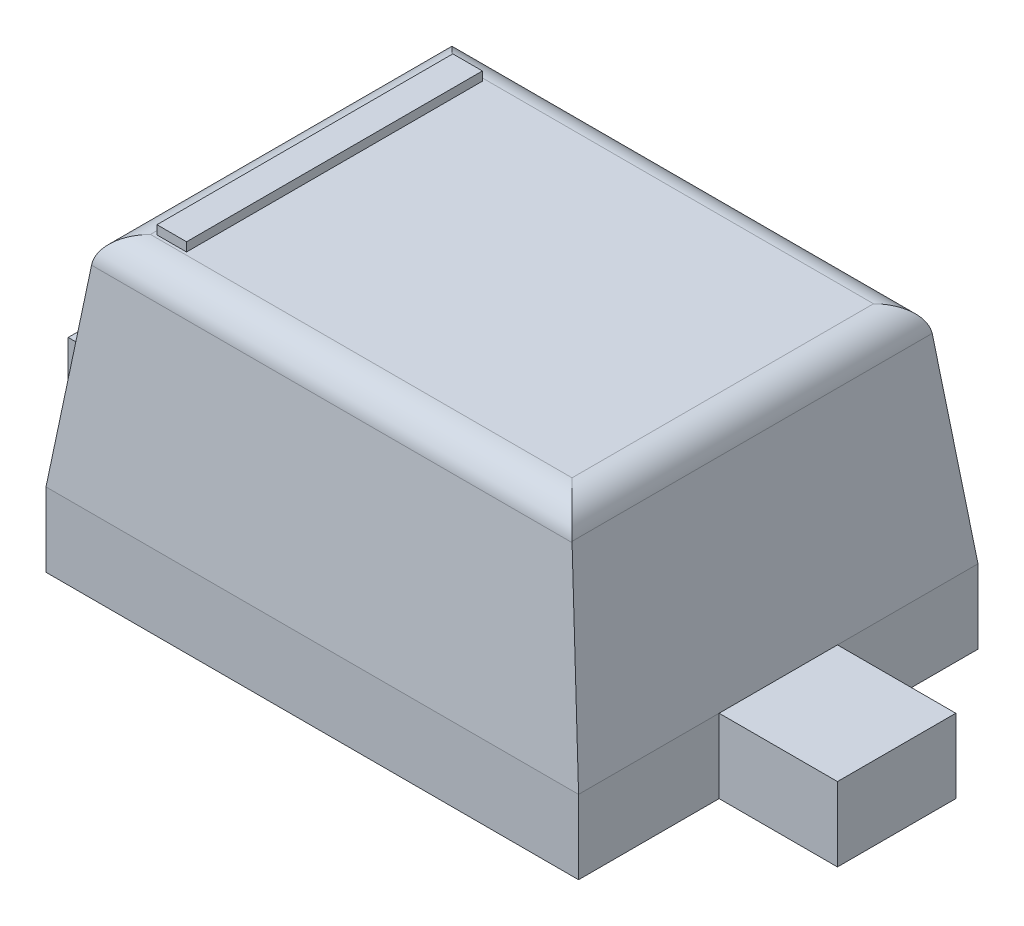
ISO-10303-21;
HEADER;
FILE_DESCRIPTION(('STEP AP214'),'2;1');
FILE_NAME('part.step','',(''),(''),'','','');
FILE_SCHEMA(('AUTOMOTIVE_DESIGN { 1 0 10303 214 1 1 1 1 }'));
ENDSEC;
DATA;
#1=APPLICATION_CONTEXT('core data for automotive mechanical design processes');
#2=APPLICATION_PROTOCOL_DEFINITION('international standard','automotive_design',2000,#1);
#3=PRODUCT_CONTEXT('',#1,'mechanical');
#4=PRODUCT('Part','Part','',(#3));
#5=PRODUCT_RELATED_PRODUCT_CATEGORY('part','',(#4));
#6=PRODUCT_DEFINITION_FORMATION('','',#4);
#7=PRODUCT_DEFINITION_CONTEXT('part definition',#1,'design');
#8=PRODUCT_DEFINITION('design','',#6,#7);
#9=PRODUCT_DEFINITION_SHAPE('','',#8);
#10=(LENGTH_UNIT() NAMED_UNIT(*) SI_UNIT(.MILLI.,.METRE.));
#11=(NAMED_UNIT(*) PLANE_ANGLE_UNIT() SI_UNIT($,.RADIAN.));
#12=(NAMED_UNIT(*) SI_UNIT($,.STERADIAN.) SOLID_ANGLE_UNIT());
#13=UNCERTAINTY_MEASURE_WITH_UNIT(LENGTH_MEASURE(1.E-05),#10,'distance_accuracy_value','');
#14=(GEOMETRIC_REPRESENTATION_CONTEXT(3) GLOBAL_UNCERTAINTY_ASSIGNED_CONTEXT((#13)) GLOBAL_UNIT_ASSIGNED_CONTEXT((#10,
#11,#12)) REPRESENTATION_CONTEXT('',''));
#15=CARTESIAN_POINT('',(0.,0.,0.));
#16=DIRECTION('',(0.,0.,1.));
#17=DIRECTION('',(1.,0.,0.));
#18=AXIS2_PLACEMENT_3D('',#15,#16,#17);
#19=CARTESIAN_POINT('',(-0.7,1.03,-0.5));
#20=DIRECTION('',(1.,0.,0.));
#21=DIRECTION('',(0.,0.,-1.));
#22=AXIS2_PLACEMENT_3D('',#19,#20,#21);
#23=PLANE('',#22);
#24=DIRECTION('',(0.,0.,1.));
#25=VECTOR('',#24,1.);
#26=CARTESIAN_POINT('',(-0.7,1.,-0.5));
#27=LINE('',#26,#25);
#28=CARTESIAN_POINT('',(-0.7,1.,-0.5));
#29=VERTEX_POINT('',#28);
#30=CARTESIAN_POINT('',(-0.7,1.,0.5));
#31=VERTEX_POINT('',#30);
#32=EDGE_CURVE('E121',#29,#31,#27,.T.);
#33=ORIENTED_EDGE('',*,*,#32,.T.);
#34=DIRECTION('',(0.,-1.,0.));
#35=VECTOR('',#34,1.);
#36=CARTESIAN_POINT('',(-0.7,1.03,0.5));
#37=LINE('',#36,#35);
#38=CARTESIAN_POINT('',(-0.7,1.03,0.5));
#39=VERTEX_POINT('',#38);
#40=EDGE_CURVE('E13',#39,#31,#37,.T.);
#41=ORIENTED_EDGE('',*,*,#40,.F.);
#42=DIRECTION('',(0.,0.,1.));
#43=VECTOR('',#42,1.);
#44=CARTESIAN_POINT('',(-0.7,1.03,-0.5));
#45=LINE('',#44,#43);
#46=CARTESIAN_POINT('',(-0.7,1.03,-0.5));
#47=VERTEX_POINT('',#46);
#48=EDGE_CURVE('E109',#47,#39,#45,.T.);
#49=ORIENTED_EDGE('',*,*,#48,.F.);
#50=DIRECTION('',(0.,-1.,0.));
#51=VECTOR('',#50,1.);
#52=CARTESIAN_POINT('',(-0.7,1.03,-0.5));
#53=LINE('',#52,#51);
#54=EDGE_CURVE('E117',#47,#29,#53,.T.);
#55=ORIENTED_EDGE('',*,*,#54,.T.);
#56=EDGE_LOOP('',(#33,#41,#49,#55));
#57=FACE_BOUND('',#56,.T.);
#58=ADVANCED_FACE('F58',(#57),#23,.F.);
#59=CARTESIAN_POINT('',(-0.7,1.03,0.5));
#60=DIRECTION('',(0.,0.,-1.));
#61=DIRECTION('',(-1.,0.,0.));
#62=AXIS2_PLACEMENT_3D('',#59,#60,#61);
#63=PLANE('',#62);
#64=DIRECTION('',(1.,0.,0.));
#65=VECTOR('',#64,1.);
#66=CARTESIAN_POINT('',(-0.7,1.,0.5));
#67=LINE('',#66,#65);
#68=CARTESIAN_POINT('',(-0.6,1.,0.5));
#69=VERTEX_POINT('',#68);
#70=EDGE_CURVE('E113',#31,#69,#67,.T.);
#71=ORIENTED_EDGE('',*,*,#70,.T.);
#72=DIRECTION('',(0.,-1.,0.));
#73=VECTOR('',#72,1.);
#74=CARTESIAN_POINT('',(-0.6,1.03,0.5));
#75=LINE('',#74,#73);
#76=CARTESIAN_POINT('',(-0.6,1.03,0.5));
#77=VERTEX_POINT('',#76);
#78=EDGE_CURVE('E66',#77,#69,#75,.T.);
#79=ORIENTED_EDGE('',*,*,#78,.F.);
#80=DIRECTION('',(1.,0.,0.));
#81=VECTOR('',#80,1.);
#82=CARTESIAN_POINT('',(-0.7,1.03,0.5));
#83=LINE('',#82,#81);
#84=EDGE_CURVE('E104',#39,#77,#83,.T.);
#85=ORIENTED_EDGE('',*,*,#84,.F.);
#86=ORIENTED_EDGE('',*,*,#40,.T.);
#87=EDGE_LOOP('',(#71,#79,#85,#86));
#88=FACE_BOUND('',#87,.T.);
#89=ADVANCED_FACE('F112',(#88),#63,.F.);
#90=CARTESIAN_POINT('',(-0.6,1.03,-0.5));
#91=DIRECTION('',(-1.,0.,0.));
#92=DIRECTION('',(0.,0.,1.));
#93=AXIS2_PLACEMENT_3D('',#90,#91,#92);
#94=PLANE('',#93);
#95=DIRECTION('',(0.,0.,-1.));
#96=VECTOR('',#95,1.);
#97=CARTESIAN_POINT('',(-0.6,1.,-0.5));
#98=LINE('',#97,#96);
#99=CARTESIAN_POINT('',(-0.6,1.,-0.5));
#100=VERTEX_POINT('',#99);
#101=EDGE_CURVE('E91',#69,#100,#98,.T.);
#102=ORIENTED_EDGE('',*,*,#101,.T.);
#103=DIRECTION('',(0.,-1.,0.));
#104=VECTOR('',#103,1.);
#105=CARTESIAN_POINT('',(-0.6,1.03,-0.5));
#106=LINE('',#105,#104);
#107=CARTESIAN_POINT('',(-0.6,1.03,-0.5));
#108=VERTEX_POINT('',#107);
#109=EDGE_CURVE('E114',#108,#100,#106,.T.);
#110=ORIENTED_EDGE('',*,*,#109,.F.);
#111=DIRECTION('',(0.,0.,-1.));
#112=VECTOR('',#111,1.);
#113=CARTESIAN_POINT('',(-0.6,1.03,-0.5));
#114=LINE('',#113,#112);
#115=EDGE_CURVE('E107',#77,#108,#114,.T.);
#116=ORIENTED_EDGE('',*,*,#115,.F.);
#117=ORIENTED_EDGE('',*,*,#78,.T.);
#118=EDGE_LOOP('',(#102,#110,#116,#117));
#119=FACE_BOUND('',#118,.T.);
#120=ADVANCED_FACE('F115',(#119),#94,.F.);
#121=CARTESIAN_POINT('',(-0.7,1.03,-0.5));
#122=DIRECTION('',(0.,0.,1.));
#123=DIRECTION('',(1.,0.,0.));
#124=AXIS2_PLACEMENT_3D('',#121,#122,#123);
#125=PLANE('',#124);
#126=DIRECTION('',(-1.,0.,0.));
#127=VECTOR('',#126,1.);
#128=CARTESIAN_POINT('',(-0.7,1.,-0.5));
#129=LINE('',#128,#127);
#130=EDGE_CURVE('E97',#100,#29,#129,.T.);
#131=ORIENTED_EDGE('',*,*,#130,.T.);
#132=ORIENTED_EDGE('',*,*,#54,.F.);
#133=DIRECTION('',(-1.,0.,0.));
#134=VECTOR('',#133,1.);
#135=CARTESIAN_POINT('',(-0.7,1.03,-0.5));
#136=LINE('',#135,#134);
#137=EDGE_CURVE('E74',#108,#47,#136,.T.);
#138=ORIENTED_EDGE('',*,*,#137,.F.);
#139=ORIENTED_EDGE('',*,*,#109,.T.);
#140=EDGE_LOOP('',(#131,#132,#138,#139));
#141=FACE_BOUND('',#140,.T.);
#142=ADVANCED_FACE('F128',(#141),#125,.F.);
#143=CARTESIAN_POINT('',(0.,1.03,0.));
#144=DIRECTION('',(0.,1.,0.));
#145=DIRECTION('',(0.,0.,1.));
#146=AXIS2_PLACEMENT_3D('',#143,#144,#145);
#147=PLANE('',#146);
#148=ORIENTED_EDGE('',*,*,#48,.T.);
#149=ORIENTED_EDGE('',*,*,#84,.T.);
#150=ORIENTED_EDGE('',*,*,#115,.T.);
#151=ORIENTED_EDGE('',*,*,#137,.T.);
#152=EDGE_LOOP('',(#148,#149,#150,#151));
#153=FACE_BOUND('',#152,.T.);
#154=ADVANCED_FACE('F105',(#153),#147,.T.);
#155=CARTESIAN_POINT('',(0.,1.,0.));
#156=DIRECTION('',(0.,1.,0.));
#157=DIRECTION('',(0.,0.,1.));
#158=AXIS2_PLACEMENT_3D('',#155,#156,#157);
#159=PLANE('',#158);
#160=ORIENTED_EDGE('',*,*,#32,.F.);
#161=ORIENTED_EDGE('',*,*,#130,.F.);
#162=ORIENTED_EDGE('',*,*,#101,.F.);
#163=ORIENTED_EDGE('',*,*,#70,.F.);
#164=EDGE_LOOP('',(#160,#161,#162,#163));
#165=FACE_BOUND('',#164,.T.);
#166=ADVANCED_FACE('F131',(#165),#159,.F.);
#167=CLOSED_SHELL('',(#58,#89,#120,#142,#154,#166));
#168=MANIFOLD_SOLID_BREP('B2',#167);
#169=CARTESIAN_POINT('',(0.,1.,0.));
#170=DIRECTION('',(0.,1.,0.));
#171=DIRECTION('',(0.,0.,1.));
#172=AXIS2_PLACEMENT_3D('',#169,#170,#171);
#173=PLANE('',#172);
#174=DIRECTION('',(0.,0.,-1.));
#175=VECTOR('',#174,1.);
#176=CARTESIAN_POINT('',(0.712448360330523,1.,-0.6));
#177=LINE('',#176,#175);
#178=CARTESIAN_POINT('',(0.712448360330523,1.,0.509501243788791));
#179=VERTEX_POINT('',#178);
#180=CARTESIAN_POINT('',(0.712448360330523,1.,-0.509501243788791));
#181=VERTEX_POINT('',#180);
#182=EDGE_CURVE('E333',#179,#181,#177,.T.);
#183=ORIENTED_EDGE('',*,*,#182,.T.);
#184=DIRECTION('',(-1.,0.,0.));
#185=VECTOR('',#184,1.);
#186=CARTESIAN_POINT('',(-0.8,1.,-0.509501243788791));
#187=LINE('',#186,#185);
#188=CARTESIAN_POINT('',(-0.712448360330523,1.,-0.509501243788791));
#189=VERTEX_POINT('',#188);
#190=EDGE_CURVE('E335',#181,#189,#187,.T.);
#191=ORIENTED_EDGE('',*,*,#190,.T.);
#192=DIRECTION('',(0.,0.,1.));
#193=VECTOR('',#192,1.);
#194=CARTESIAN_POINT('',(-0.712448360330523,1.,0.6));
#195=LINE('',#194,#193);
#196=CARTESIAN_POINT('',(-0.712448360330523,1.,0.509501243788791));
#197=VERTEX_POINT('',#196);
#198=EDGE_CURVE('E323',#189,#197,#195,.T.);
#199=ORIENTED_EDGE('',*,*,#198,.T.);
#200=DIRECTION('',(1.,0.,0.));
#201=VECTOR('',#200,1.);
#202=CARTESIAN_POINT('',(0.8,1.,0.509501243788791));
#203=LINE('',#202,#201);
#204=EDGE_CURVE('E330',#197,#179,#203,.T.);
#205=ORIENTED_EDGE('',*,*,#204,.T.);
#206=EDGE_LOOP('',(#183,#191,#199,#205));
#207=FACE_BOUND('',#206,.T.);
#208=ADVANCED_FACE('F192',(#207),#173,.T.);
#209=CARTESIAN_POINT('',(0.,0.25,0.));
#210=DIRECTION('',(0.,1.,0.));
#211=DIRECTION('',(0.,0.,1.));
#212=AXIS2_PLACEMENT_3D('',#209,#210,#211);
#213=PLANE('',#212);
#214=DIRECTION('',(0.,0.,1.));
#215=VECTOR('',#214,1.);
#216=CARTESIAN_POINT('',(-0.900000000000001,0.25,0.674999999999999));
#217=LINE('',#216,#215);
#218=CARTESIAN_POINT('',(-0.900000000000001,0.25,-0.674999999999999));
#219=VERTEX_POINT('',#218);
#220=CARTESIAN_POINT('',(-0.900000000000001,0.25,0.674999999999999));
#221=VERTEX_POINT('',#220);
#222=EDGE_CURVE('E318',#219,#221,#217,.T.);
#223=ORIENTED_EDGE('',*,*,#222,.F.);
#224=DIRECTION('',(-1.,0.,0.));
#225=VECTOR('',#224,1.);
#226=CARTESIAN_POINT('',(0.900000000000001,0.25,-0.674999999999999));
#227=LINE('',#226,#225);
#228=CARTESIAN_POINT('',(0.900000000000001,0.25,-0.674999999999999));
#229=VERTEX_POINT('',#228);
#230=EDGE_CURVE('E279',#229,#219,#227,.T.);
#231=ORIENTED_EDGE('',*,*,#230,.F.);
#232=DIRECTION('',(0.,0.,-1.));
#233=VECTOR('',#232,1.);
#234=CARTESIAN_POINT('',(0.900000000000001,0.25,0.674999999999999));
#235=LINE('',#234,#233);
#236=CARTESIAN_POINT('',(0.900000000000001,0.25,0.674999999999999));
#237=VERTEX_POINT('',#236);
#238=EDGE_CURVE('E257',#237,#229,#235,.T.);
#239=ORIENTED_EDGE('',*,*,#238,.F.);
#240=DIRECTION('',(1.,0.,0.));
#241=VECTOR('',#240,1.);
#242=CARTESIAN_POINT('',(0.900000000000001,0.25,0.674999999999999));
#243=LINE('',#242,#241);
#244=EDGE_CURVE('E264',#221,#237,#243,.T.);
#245=ORIENTED_EDGE('',*,*,#244,.F.);
#246=EDGE_LOOP('',(#223,#231,#239,#245));
#247=FACE_BOUND('',#246,.T.);
#248=ADVANCED_FACE('F278',(#247),#213,.F.);
#249=CARTESIAN_POINT('',(0.,0.0693069306930688,0.693069306930692));
#250=DIRECTION('',(0.,-0.0995037190209983,-0.995037190209989));
#251=DIRECTION('',(0.,0.995037190209989,-0.0995037190209984));
#252=AXIS2_PLACEMENT_3D('',#249,#250,#251);
#253=PLANE('',#252);
#254=DIRECTION('',(-0.131519189844287,0.986393923832144,-0.0986393923832138));
#255=VECTOR('',#254,1.);
#256=CARTESIAN_POINT('',(0.900000000000001,0.25,0.674999999999999));
#257=LINE('',#256,#255);
#258=CARTESIAN_POINT('',(0.81200661707972,0.9099503719021,0.60900496280979));
#259=VERTEX_POINT('',#258);
#260=EDGE_CURVE('E253',#237,#259,#257,.T.);
#261=ORIENTED_EDGE('',*,*,#260,.T.);
#262=DIRECTION('',(1.,0.,0.));
#263=VECTOR('',#262,1.);
#264=CARTESIAN_POINT('',(-0.8,0.9099503719021,0.60900496280979));
#265=LINE('',#264,#263);
#266=CARTESIAN_POINT('',(-0.81200661707972,0.9099503719021,0.60900496280979));
#267=VERTEX_POINT('',#266);
#268=EDGE_CURVE('E56',#259,#267,#265,.F.);
#269=ORIENTED_EDGE('',*,*,#268,.T.);
#270=DIRECTION('',(0.131519189844287,0.986393923832144,-0.0986393923832135));
#271=VECTOR('',#270,1.);
#272=CARTESIAN_POINT('',(-0.900000000000001,0.25,0.674999999999999));
#273=LINE('',#272,#271);
#274=EDGE_CURVE('E263',#221,#267,#273,.T.);
#275=ORIENTED_EDGE('',*,*,#274,.F.);
#276=ORIENTED_EDGE('',*,*,#244,.T.);
#277=EDGE_LOOP('',(#261,#269,#275,#276));
#278=FACE_BOUND('',#277,.T.);
#279=ADVANCED_FACE('F268',(#278),#253,.F.);
#280=CARTESIAN_POINT('',(-0.91703056768559,0.12227074235808,0.));
#281=DIRECTION('',(0.991227900682635,-0.132163720091019,0.));
#282=DIRECTION('',(0.132163720091019,0.991227900682635,0.));
#283=AXIS2_PLACEMENT_3D('',#280,#281,#282);
#284=PLANE('',#283);
#285=DIRECTION('',(0.,0.,1.));
#286=VECTOR('',#285,1.);
#287=CARTESIAN_POINT('',(-0.811571150398787,0.913216372009102,-0.6));
#288=LINE('',#287,#286);
#289=CARTESIAN_POINT('',(-0.811571150398787,0.913216372009102,0.608624033857055));
#290=VERTEX_POINT('',#289);
#291=CARTESIAN_POINT('',(-0.811571150398787,0.913216372009102,-0.608624033857054));
#292=VERTEX_POINT('',#291);
#293=EDGE_CURVE('E338',#290,#292,#288,.F.);
#294=ORIENTED_EDGE('',*,*,#293,.T.);
#295=CARTESIAN_POINT('',(-0.813333333333334,0.9,-0.509501243788791));
#296=DIRECTION('',(0.991227900682635,-0.132163720091019,0.));
#297=DIRECTION('',(0.132163720091019,0.991227900682635,0.));
#298=AXIS2_PLACEMENT_3D('',#295,#296,#297);
#299=ELLIPSE('',#298,0.10088497300281,0.1);
#300=CARTESIAN_POINT('',(-0.81200661707972,0.9099503719021,-0.60900496280979));
#301=VERTEX_POINT('',#300);
#302=EDGE_CURVE('E342',#292,#301,#299,.F.);
#303=ORIENTED_EDGE('',*,*,#302,.T.);
#304=DIRECTION('',(0.131519189844287,0.986393923832144,0.0986393923832138));
#305=VECTOR('',#304,1.);
#306=CARTESIAN_POINT('',(-0.900000000000001,0.25,-0.674999999999999));
#307=LINE('',#306,#305);
#308=EDGE_CURVE('E331',#219,#301,#307,.T.);
#309=ORIENTED_EDGE('',*,*,#308,.F.);
#310=ORIENTED_EDGE('',*,*,#222,.T.);
#311=ORIENTED_EDGE('',*,*,#274,.T.);
#312=CARTESIAN_POINT('',(-0.813333333333334,0.9,0.509501243788791));
#313=DIRECTION('',(0.991227900682635,-0.132163720091019,0.));
#314=DIRECTION('',(-0.132163720091019,-0.991227900682635,0.));
#315=AXIS2_PLACEMENT_3D('',#312,#313,#314);
#316=ELLIPSE('',#315,0.10088497300281,0.1);
#317=EDGE_CURVE('E340',#267,#290,#316,.F.);
#318=ORIENTED_EDGE('',*,*,#317,.T.);
#319=EDGE_LOOP('',(#294,#303,#309,#310,#311,#318));
#320=FACE_BOUND('',#319,.T.);
#321=ADVANCED_FACE('F368',(#320),#284,.F.);
#322=CARTESIAN_POINT('',(0.91703056768559,0.12227074235808,0.));
#323=DIRECTION('',(-0.991227900682635,-0.132163720091019,0.));
#324=DIRECTION('',(0.132163720091019,-0.991227900682635,0.));
#325=AXIS2_PLACEMENT_3D('',#322,#323,#324);
#326=PLANE('',#325);
#327=DIRECTION('',(-0.131519189844287,0.986393923832144,0.0986393923832135));
#328=VECTOR('',#327,1.);
#329=CARTESIAN_POINT('',(0.900000000000001,0.25,-0.674999999999999));
#330=LINE('',#329,#328);
#331=CARTESIAN_POINT('',(0.81200661707972,0.9099503719021,-0.60900496280979));
#332=VERTEX_POINT('',#331);
#333=EDGE_CURVE('E397',#229,#332,#330,.T.);
#334=ORIENTED_EDGE('',*,*,#333,.T.);
#335=CARTESIAN_POINT('',(0.813333333333334,0.9,-0.509501243788791));
#336=DIRECTION('',(-0.991227900682635,-0.132163720091019,0.));
#337=DIRECTION('',(0.132163720091019,-0.991227900682635,0.));
#338=AXIS2_PLACEMENT_3D('',#335,#336,#337);
#339=ELLIPSE('',#338,0.10088497300281,0.1);
#340=CARTESIAN_POINT('',(0.811571150398787,0.913216372009102,-0.608624033857055));
#341=VERTEX_POINT('',#340);
#342=EDGE_CURVE('E201',#332,#341,#339,.F.);
#343=ORIENTED_EDGE('',*,*,#342,.T.);
#344=DIRECTION('',(0.,0.,-1.));
#345=VECTOR('',#344,1.);
#346=CARTESIAN_POINT('',(0.811571150398787,0.913216372009102,0.6));
#347=LINE('',#346,#345);
#348=CARTESIAN_POINT('',(0.811571150398787,0.913216372009102,0.608624033857054));
#349=VERTEX_POINT('',#348);
#350=EDGE_CURVE('E212',#341,#349,#347,.F.);
#351=ORIENTED_EDGE('',*,*,#350,.T.);
#352=CARTESIAN_POINT('',(0.813333333333334,0.9,0.509501243788791));
#353=DIRECTION('',(-0.991227900682635,-0.132163720091019,0.));
#354=DIRECTION('',(-0.132163720091019,0.991227900682635,0.));
#355=AXIS2_PLACEMENT_3D('',#352,#353,#354);
#356=ELLIPSE('',#355,0.10088497300281,0.1);
#357=EDGE_CURVE('E260',#349,#259,#356,.F.);
#358=ORIENTED_EDGE('',*,*,#357,.T.);
#359=ORIENTED_EDGE('',*,*,#260,.F.);
#360=ORIENTED_EDGE('',*,*,#238,.T.);
#361=EDGE_LOOP('',(#334,#343,#351,#358,#359,#360));
#362=FACE_BOUND('',#361,.T.);
#363=ADVANCED_FACE('F255',(#362),#326,.F.);
#364=CARTESIAN_POINT('',(0.,0.0693069306930688,-0.693069306930692));
#365=DIRECTION('',(0.,-0.0995037190209983,0.995037190209989));
#366=DIRECTION('',(0.,-0.995037190209989,-0.0995037190209984));
#367=AXIS2_PLACEMENT_3D('',#364,#365,#366);
#368=PLANE('',#367);
#369=ORIENTED_EDGE('',*,*,#308,.T.);
#370=DIRECTION('',(-1.,0.,0.));
#371=VECTOR('',#370,1.);
#372=CARTESIAN_POINT('',(0.8,0.9099503719021,-0.60900496280979));
#373=LINE('',#372,#371);
#374=EDGE_CURVE('E344',#301,#332,#373,.F.);
#375=ORIENTED_EDGE('',*,*,#374,.T.);
#376=ORIENTED_EDGE('',*,*,#333,.F.);
#377=ORIENTED_EDGE('',*,*,#230,.T.);
#378=EDGE_LOOP('',(#369,#375,#376,#377));
#379=FACE_BOUND('',#378,.T.);
#380=ADVANCED_FACE('F389',(#379),#368,.F.);
#381=CARTESIAN_POINT('',(0.,0.9,0.509501243788791));
#382=DIRECTION('',(-1.,0.,0.));
#383=DIRECTION('',(0.,0.,1.));
#384=AXIS2_PLACEMENT_3D('',#381,#382,#383);
#385=CYLINDRICAL_SURFACE('',#384,0.1);
#386=ORIENTED_EDGE('',*,*,#268,.F.);
#387=ORIENTED_EDGE('',*,*,#357,.F.);
#388=CARTESIAN_POINT('',(0.712448360330523,0.9,0.509501243788791));
#389=DIRECTION('',(-0.707106781186547,0.,0.707106781186548));
#390=DIRECTION('',(-0.707106781186547,0.,-0.707106781186547));
#391=AXIS2_PLACEMENT_3D('',#388,#389,#390);
#392=ELLIPSE('',#391,0.14142135623731,0.1);
#393=EDGE_CURVE('E196',#179,#349,#392,.F.);
#394=ORIENTED_EDGE('',*,*,#393,.F.);
#395=ORIENTED_EDGE('',*,*,#204,.F.);
#396=CARTESIAN_POINT('',(-0.712448360330523,0.9,0.509501243788791));
#397=DIRECTION('',(-0.707106781186547,0.,-0.707106781186547));
#398=DIRECTION('',(0.707106781186547,0.,-0.707106781186548));
#399=AXIS2_PLACEMENT_3D('',#396,#397,#398);
#400=ELLIPSE('',#399,0.14142135623731,0.1);
#401=EDGE_CURVE('E354',#290,#197,#400,.T.);
#402=ORIENTED_EDGE('',*,*,#401,.F.);
#403=ORIENTED_EDGE('',*,*,#317,.F.);
#404=EDGE_LOOP('',(#386,#387,#394,#395,#402,#403));
#405=FACE_BOUND('',#404,.T.);
#406=ADVANCED_FACE('F194',(#405),#385,.T.);
#407=CARTESIAN_POINT('',(0.712448360330523,0.9,0.));
#408=DIRECTION('',(0.,0.,1.));
#409=DIRECTION('',(1.,0.,0.));
#410=AXIS2_PLACEMENT_3D('',#407,#408,#409);
#411=CYLINDRICAL_SURFACE('',#410,0.1);
#412=ORIENTED_EDGE('',*,*,#393,.T.);
#413=ORIENTED_EDGE('',*,*,#350,.F.);
#414=CARTESIAN_POINT('',(0.712448360330523,0.9,-0.509501243788791));
#415=DIRECTION('',(0.707106781186547,0.,0.707106781186547));
#416=DIRECTION('',(-0.707106781186547,0.,0.707106781186548));
#417=AXIS2_PLACEMENT_3D('',#414,#415,#416);
#418=ELLIPSE('',#417,0.14142135623731,0.1);
#419=EDGE_CURVE('E352',#181,#341,#418,.F.);
#420=ORIENTED_EDGE('',*,*,#419,.F.);
#421=ORIENTED_EDGE('',*,*,#182,.F.);
#422=EDGE_LOOP('',(#412,#413,#420,#421));
#423=FACE_BOUND('',#422,.T.);
#424=ADVANCED_FACE('F421',(#423),#411,.T.);
#425=CARTESIAN_POINT('',(-0.712448360330523,0.9,0.));
#426=DIRECTION('',(0.,0.,-1.));
#427=DIRECTION('',(-1.,0.,0.));
#428=AXIS2_PLACEMENT_3D('',#425,#426,#427);
#429=CYLINDRICAL_SURFACE('',#428,0.1);
#430=ORIENTED_EDGE('',*,*,#401,.T.);
#431=ORIENTED_EDGE('',*,*,#198,.F.);
#432=CARTESIAN_POINT('',(-0.712448360330523,0.9,-0.509501243788791));
#433=DIRECTION('',(0.707106781186547,0.,-0.707106781186548));
#434=DIRECTION('',(-0.707106781186547,0.,-0.707106781186547));
#435=AXIS2_PLACEMENT_3D('',#432,#433,#434);
#436=ELLIPSE('',#435,0.14142135623731,0.1);
#437=EDGE_CURVE('E350',#292,#189,#436,.T.);
#438=ORIENTED_EDGE('',*,*,#437,.F.);
#439=ORIENTED_EDGE('',*,*,#293,.F.);
#440=EDGE_LOOP('',(#430,#431,#438,#439));
#441=FACE_BOUND('',#440,.T.);
#442=ADVANCED_FACE('F426',(#441),#429,.T.);
#443=CARTESIAN_POINT('',(0.,0.9,-0.509501243788791));
#444=DIRECTION('',(1.,0.,0.));
#445=DIRECTION('',(0.,0.,-1.));
#446=AXIS2_PLACEMENT_3D('',#443,#444,#445);
#447=CYLINDRICAL_SURFACE('',#446,0.1);
#448=ORIENTED_EDGE('',*,*,#342,.F.);
#449=ORIENTED_EDGE('',*,*,#374,.F.);
#450=ORIENTED_EDGE('',*,*,#302,.F.);
#451=ORIENTED_EDGE('',*,*,#437,.T.);
#452=ORIENTED_EDGE('',*,*,#190,.F.);
#453=ORIENTED_EDGE('',*,*,#419,.T.);
#454=EDGE_LOOP('',(#448,#449,#450,#451,#452,#453));
#455=FACE_BOUND('',#454,.T.);
#456=ADVANCED_FACE('F418',(#455),#447,.T.);
#457=CLOSED_SHELL('',(#208,#248,#279,#321,#363,#380,#406,#424,#442,#456));
#458=MANIFOLD_SOLID_BREP('B7',#457);
#459=CARTESIAN_POINT('',(-1.3,0.25,-0.2));
#460=DIRECTION('',(1.,0.,0.));
#461=DIRECTION('',(0.,0.,-1.));
#462=AXIS2_PLACEMENT_3D('',#459,#460,#461);
#463=PLANE('',#462);
#464=DIRECTION('',(0.,0.,1.));
#465=VECTOR('',#464,1.);
#466=CARTESIAN_POINT('',(-1.3,0.,-0.2));
#467=LINE('',#466,#465);
#468=CARTESIAN_POINT('',(-1.3,0.,-0.2));
#469=VERTEX_POINT('',#468);
#470=CARTESIAN_POINT('',(-1.3,0.,0.2));
#471=VERTEX_POINT('',#470);
#472=EDGE_CURVE('E589',#469,#471,#467,.T.);
#473=ORIENTED_EDGE('',*,*,#472,.T.);
#474=DIRECTION('',(0.,-1.,0.));
#475=VECTOR('',#474,1.);
#476=CARTESIAN_POINT('',(-1.3,0.25,0.2));
#477=LINE('',#476,#475);
#478=CARTESIAN_POINT('',(-1.3,0.25,0.2));
#479=VERTEX_POINT('',#478);
#480=EDGE_CURVE('E190',#479,#471,#477,.T.);
#481=ORIENTED_EDGE('',*,*,#480,.F.);
#482=DIRECTION('',(0.,0.,1.));
#483=VECTOR('',#482,1.);
#484=CARTESIAN_POINT('',(-1.3,0.25,-0.2));
#485=LINE('',#484,#483);
#486=CARTESIAN_POINT('',(-1.3,0.25,-0.2));
#487=VERTEX_POINT('',#486);
#488=EDGE_CURVE('E577',#487,#479,#485,.T.);
#489=ORIENTED_EDGE('',*,*,#488,.F.);
#490=DIRECTION('',(0.,-1.,0.));
#491=VECTOR('',#490,1.);
#492=CARTESIAN_POINT('',(-1.3,0.25,-0.2));
#493=LINE('',#492,#491);
#494=EDGE_CURVE('E585',#487,#469,#493,.T.);
#495=ORIENTED_EDGE('',*,*,#494,.T.);
#496=EDGE_LOOP('',(#473,#481,#489,#495));
#497=FACE_BOUND('',#496,.T.);
#498=ADVANCED_FACE('F526',(#497),#463,.F.);
#499=CARTESIAN_POINT('',(-0.500000000000001,0.25,0.2));
#500=DIRECTION('',(0.,0.,-1.));
#501=DIRECTION('',(-1.,0.,0.));
#502=AXIS2_PLACEMENT_3D('',#499,#500,#501);
#503=PLANE('',#502);
#504=DIRECTION('',(1.,0.,0.));
#505=VECTOR('',#504,1.);
#506=CARTESIAN_POINT('',(-0.500000000000001,0.,0.2));
#507=LINE('',#506,#505);
#508=CARTESIAN_POINT('',(-0.500000000000001,0.,0.2));
#509=VERTEX_POINT('',#508);
#510=EDGE_CURVE('E581',#471,#509,#507,.T.);
#511=ORIENTED_EDGE('',*,*,#510,.T.);
#512=DIRECTION('',(0.,-1.,0.));
#513=VECTOR('',#512,1.);
#514=CARTESIAN_POINT('',(-0.500000000000001,0.25,0.2));
#515=LINE('',#514,#513);
#516=CARTESIAN_POINT('',(-0.500000000000001,0.25,0.2));
#517=VERTEX_POINT('',#516);
#518=EDGE_CURVE('E534',#517,#509,#515,.T.);
#519=ORIENTED_EDGE('',*,*,#518,.F.);
#520=DIRECTION('',(1.,0.,0.));
#521=VECTOR('',#520,1.);
#522=CARTESIAN_POINT('',(-0.500000000000001,0.25,0.2));
#523=LINE('',#522,#521);
#524=EDGE_CURVE('E572',#479,#517,#523,.T.);
#525=ORIENTED_EDGE('',*,*,#524,.F.);
#526=ORIENTED_EDGE('',*,*,#480,.T.);
#527=EDGE_LOOP('',(#511,#519,#525,#526));
#528=FACE_BOUND('',#527,.T.);
#529=ADVANCED_FACE('F580',(#528),#503,.F.);
#530=CARTESIAN_POINT('',(-0.500000000000001,0.25,-0.2));
#531=DIRECTION('',(-1.,0.,0.));
#532=DIRECTION('',(0.,0.,1.));
#533=AXIS2_PLACEMENT_3D('',#530,#531,#532);
#534=PLANE('',#533);
#535=DIRECTION('',(0.,0.,-1.));
#536=VECTOR('',#535,1.);
#537=CARTESIAN_POINT('',(-0.500000000000001,0.,-0.2));
#538=LINE('',#537,#536);
#539=CARTESIAN_POINT('',(-0.500000000000001,0.,-0.2));
#540=VERTEX_POINT('',#539);
#541=EDGE_CURVE('E559',#509,#540,#538,.T.);
#542=ORIENTED_EDGE('',*,*,#541,.T.);
#543=DIRECTION('',(0.,-1.,0.));
#544=VECTOR('',#543,1.);
#545=CARTESIAN_POINT('',(-0.500000000000001,0.25,-0.2));
#546=LINE('',#545,#544);
#547=CARTESIAN_POINT('',(-0.500000000000001,0.25,-0.2));
#548=VERTEX_POINT('',#547);
#549=EDGE_CURVE('E582',#548,#540,#546,.T.);
#550=ORIENTED_EDGE('',*,*,#549,.F.);
#551=DIRECTION('',(0.,0.,-1.));
#552=VECTOR('',#551,1.);
#553=CARTESIAN_POINT('',(-0.500000000000001,0.25,-0.2));
#554=LINE('',#553,#552);
#555=EDGE_CURVE('E575',#517,#548,#554,.T.);
#556=ORIENTED_EDGE('',*,*,#555,.F.);
#557=ORIENTED_EDGE('',*,*,#518,.T.);
#558=EDGE_LOOP('',(#542,#550,#556,#557));
#559=FACE_BOUND('',#558,.T.);
#560=ADVANCED_FACE('F583',(#559),#534,.F.);
#561=CARTESIAN_POINT('',(-0.500000000000001,0.25,-0.2));
#562=DIRECTION('',(0.,0.,1.));
#563=DIRECTION('',(1.,0.,0.));
#564=AXIS2_PLACEMENT_3D('',#561,#562,#563);
#565=PLANE('',#564);
#566=DIRECTION('',(-1.,0.,0.));
#567=VECTOR('',#566,1.);
#568=CARTESIAN_POINT('',(-0.500000000000001,0.,-0.2));
#569=LINE('',#568,#567);
#570=EDGE_CURVE('E565',#540,#469,#569,.T.);
#571=ORIENTED_EDGE('',*,*,#570,.T.);
#572=ORIENTED_EDGE('',*,*,#494,.F.);
#573=DIRECTION('',(-1.,0.,0.));
#574=VECTOR('',#573,1.);
#575=CARTESIAN_POINT('',(-0.500000000000001,0.25,-0.2));
#576=LINE('',#575,#574);
#577=EDGE_CURVE('E542',#548,#487,#576,.T.);
#578=ORIENTED_EDGE('',*,*,#577,.F.);
#579=ORIENTED_EDGE('',*,*,#549,.T.);
#580=EDGE_LOOP('',(#571,#572,#578,#579));
#581=FACE_BOUND('',#580,.T.);
#582=ADVANCED_FACE('F596',(#581),#565,.F.);
#583=CARTESIAN_POINT('',(0.,0.25,0.));
#584=DIRECTION('',(0.,-1.,0.));
#585=DIRECTION('',(0.,0.,-1.));
#586=AXIS2_PLACEMENT_3D('',#583,#584,#585);
#587=PLANE('',#586);
#588=ORIENTED_EDGE('',*,*,#488,.T.);
#589=ORIENTED_EDGE('',*,*,#524,.T.);
#590=ORIENTED_EDGE('',*,*,#555,.T.);
#591=ORIENTED_EDGE('',*,*,#577,.T.);
#592=EDGE_LOOP('',(#588,#589,#590,#591));
#593=FACE_BOUND('',#592,.T.);
#594=ADVANCED_FACE('F573',(#593),#587,.F.);
#595=CARTESIAN_POINT('',(0.,0.,0.));
#596=DIRECTION('',(0.,-1.,0.));
#597=DIRECTION('',(0.,0.,-1.));
#598=AXIS2_PLACEMENT_3D('',#595,#596,#597);
#599=PLANE('',#598);
#600=ORIENTED_EDGE('',*,*,#472,.F.);
#601=ORIENTED_EDGE('',*,*,#570,.F.);
#602=ORIENTED_EDGE('',*,*,#541,.F.);
#603=ORIENTED_EDGE('',*,*,#510,.F.);
#604=EDGE_LOOP('',(#600,#601,#602,#603));
#605=FACE_BOUND('',#604,.T.);
#606=ADVANCED_FACE('F599',(#605),#599,.T.);
#607=CLOSED_SHELL('',(#498,#529,#560,#582,#594,#606));
#608=MANIFOLD_SOLID_BREP('B50',#607);
#609=CARTESIAN_POINT('',(1.3,0.25,-0.2));
#610=DIRECTION('',(-1.,0.,0.));
#611=DIRECTION('',(0.,0.,1.));
#612=AXIS2_PLACEMENT_3D('',#609,#610,#611);
#613=PLANE('',#612);
#614=DIRECTION('',(0.,0.,-1.));
#615=VECTOR('',#614,1.);
#616=CARTESIAN_POINT('',(1.3,0.,-0.2));
#617=LINE('',#616,#615);
#618=CARTESIAN_POINT('',(1.3,0.,0.2));
#619=VERTEX_POINT('',#618);
#620=CARTESIAN_POINT('',(1.3,0.,-0.2));
#621=VERTEX_POINT('',#620);
#622=EDGE_CURVE('E722',#619,#621,#617,.T.);
#623=ORIENTED_EDGE('',*,*,#622,.T.);
#624=DIRECTION('',(0.,-1.,0.));
#625=VECTOR('',#624,1.);
#626=CARTESIAN_POINT('',(1.3,0.25,-0.2));
#627=LINE('',#626,#625);
#628=CARTESIAN_POINT('',(1.3,0.25,-0.2));
#629=VERTEX_POINT('',#628);
#630=EDGE_CURVE('E524',#629,#621,#627,.T.);
#631=ORIENTED_EDGE('',*,*,#630,.F.);
#632=DIRECTION('',(0.,0.,-1.));
#633=VECTOR('',#632,1.);
#634=CARTESIAN_POINT('',(1.3,0.25,-0.2));
#635=LINE('',#634,#633);
#636=CARTESIAN_POINT('',(1.3,0.25,0.2));
#637=VERTEX_POINT('',#636);
#638=EDGE_CURVE('E710',#637,#629,#635,.T.);
#639=ORIENTED_EDGE('',*,*,#638,.F.);
#640=DIRECTION('',(0.,-1.,0.));
#641=VECTOR('',#640,1.);
#642=CARTESIAN_POINT('',(1.3,0.25,0.2));
#643=LINE('',#642,#641);
#644=EDGE_CURVE('E718',#637,#619,#643,.T.);
#645=ORIENTED_EDGE('',*,*,#644,.T.);
#646=EDGE_LOOP('',(#623,#631,#639,#645));
#647=FACE_BOUND('',#646,.T.);
#648=ADVANCED_FACE('F659',(#647),#613,.F.);
#649=CARTESIAN_POINT('',(0.500000000000001,0.25,-0.2));
#650=DIRECTION('',(0.,0.,1.));
#651=DIRECTION('',(1.,0.,0.));
#652=AXIS2_PLACEMENT_3D('',#649,#650,#651);
#653=PLANE('',#652);
#654=DIRECTION('',(-1.,0.,0.));
#655=VECTOR('',#654,1.);
#656=CARTESIAN_POINT('',(0.500000000000001,0.,-0.2));
#657=LINE('',#656,#655);
#658=CARTESIAN_POINT('',(0.500000000000001,0.,-0.2));
#659=VERTEX_POINT('',#658);
#660=EDGE_CURVE('E714',#621,#659,#657,.T.);
#661=ORIENTED_EDGE('',*,*,#660,.T.);
#662=DIRECTION('',(0.,-1.,0.));
#663=VECTOR('',#662,1.);
#664=CARTESIAN_POINT('',(0.500000000000001,0.25,-0.2));
#665=LINE('',#664,#663);
#666=CARTESIAN_POINT('',(0.500000000000001,0.25,-0.2));
#667=VERTEX_POINT('',#666);
#668=EDGE_CURVE('E667',#667,#659,#665,.T.);
#669=ORIENTED_EDGE('',*,*,#668,.F.);
#670=DIRECTION('',(-1.,0.,0.));
#671=VECTOR('',#670,1.);
#672=CARTESIAN_POINT('',(0.500000000000001,0.25,-0.2));
#673=LINE('',#672,#671);
#674=EDGE_CURVE('E705',#629,#667,#673,.T.);
#675=ORIENTED_EDGE('',*,*,#674,.F.);
#676=ORIENTED_EDGE('',*,*,#630,.T.);
#677=EDGE_LOOP('',(#661,#669,#675,#676));
#678=FACE_BOUND('',#677,.T.);
#679=ADVANCED_FACE('F713',(#678),#653,.F.);
#680=CARTESIAN_POINT('',(0.500000000000001,0.25,-0.2));
#681=DIRECTION('',(1.,0.,0.));
#682=DIRECTION('',(0.,0.,-1.));
#683=AXIS2_PLACEMENT_3D('',#680,#681,#682);
#684=PLANE('',#683);
#685=DIRECTION('',(0.,0.,1.));
#686=VECTOR('',#685,1.);
#687=CARTESIAN_POINT('',(0.500000000000001,0.,-0.2));
#688=LINE('',#687,#686);
#689=CARTESIAN_POINT('',(0.500000000000001,0.,0.2));
#690=VERTEX_POINT('',#689);
#691=EDGE_CURVE('E692',#659,#690,#688,.T.);
#692=ORIENTED_EDGE('',*,*,#691,.T.);
#693=DIRECTION('',(0.,-1.,0.));
#694=VECTOR('',#693,1.);
#695=CARTESIAN_POINT('',(0.500000000000001,0.25,0.2));
#696=LINE('',#695,#694);
#697=CARTESIAN_POINT('',(0.500000000000001,0.25,0.2));
#698=VERTEX_POINT('',#697);
#699=EDGE_CURVE('E715',#698,#690,#696,.T.);
#700=ORIENTED_EDGE('',*,*,#699,.F.);
#701=DIRECTION('',(0.,0.,1.));
#702=VECTOR('',#701,1.);
#703=CARTESIAN_POINT('',(0.500000000000001,0.25,-0.2));
#704=LINE('',#703,#702);
#705=EDGE_CURVE('E708',#667,#698,#704,.T.);
#706=ORIENTED_EDGE('',*,*,#705,.F.);
#707=ORIENTED_EDGE('',*,*,#668,.T.);
#708=EDGE_LOOP('',(#692,#700,#706,#707));
#709=FACE_BOUND('',#708,.T.);
#710=ADVANCED_FACE('F716',(#709),#684,.F.);
#711=CARTESIAN_POINT('',(0.500000000000001,0.25,0.2));
#712=DIRECTION('',(0.,0.,-1.));
#713=DIRECTION('',(-1.,0.,0.));
#714=AXIS2_PLACEMENT_3D('',#711,#712,#713);
#715=PLANE('',#714);
#716=DIRECTION('',(1.,0.,0.));
#717=VECTOR('',#716,1.);
#718=CARTESIAN_POINT('',(0.500000000000001,0.,0.2));
#719=LINE('',#718,#717);
#720=EDGE_CURVE('E698',#690,#619,#719,.T.);
#721=ORIENTED_EDGE('',*,*,#720,.T.);
#722=ORIENTED_EDGE('',*,*,#644,.F.);
#723=DIRECTION('',(1.,0.,0.));
#724=VECTOR('',#723,1.);
#725=CARTESIAN_POINT('',(0.500000000000001,0.25,0.2));
#726=LINE('',#725,#724);
#727=EDGE_CURVE('E675',#698,#637,#726,.T.);
#728=ORIENTED_EDGE('',*,*,#727,.F.);
#729=ORIENTED_EDGE('',*,*,#699,.T.);
#730=EDGE_LOOP('',(#721,#722,#728,#729));
#731=FACE_BOUND('',#730,.T.);
#732=ADVANCED_FACE('F729',(#731),#715,.F.);
#733=CARTESIAN_POINT('',(0.,0.25,0.));
#734=DIRECTION('',(0.,1.,0.));
#735=DIRECTION('',(0.,0.,1.));
#736=AXIS2_PLACEMENT_3D('',#733,#734,#735);
#737=PLANE('',#736);
#738=ORIENTED_EDGE('',*,*,#638,.T.);
#739=ORIENTED_EDGE('',*,*,#674,.T.);
#740=ORIENTED_EDGE('',*,*,#705,.T.);
#741=ORIENTED_EDGE('',*,*,#727,.T.);
#742=EDGE_LOOP('',(#738,#739,#740,#741));
#743=FACE_BOUND('',#742,.T.);
#744=ADVANCED_FACE('F706',(#743),#737,.T.);
#745=CARTESIAN_POINT('',(0.,0.,0.));
#746=DIRECTION('',(0.,1.,0.));
#747=DIRECTION('',(0.,0.,1.));
#748=AXIS2_PLACEMENT_3D('',#745,#746,#747);
#749=PLANE('',#748);
#750=ORIENTED_EDGE('',*,*,#622,.F.);
#751=ORIENTED_EDGE('',*,*,#720,.F.);
#752=ORIENTED_EDGE('',*,*,#691,.F.);
#753=ORIENTED_EDGE('',*,*,#660,.F.);
#754=EDGE_LOOP('',(#750,#751,#752,#753));
#755=FACE_BOUND('',#754,.T.);
#756=ADVANCED_FACE('F732',(#755),#749,.F.);
#757=CLOSED_SHELL('',(#648,#679,#710,#732,#744,#756));
#758=MANIFOLD_SOLID_BREP('B184',#757);
#759=CARTESIAN_POINT('',(0.,0.25,0.));
#760=DIRECTION('',(0.,1.,0.));
#761=DIRECTION('',(0.,0.,1.));
#762=AXIS2_PLACEMENT_3D('',#759,#760,#761);
#763=PLANE('',#762);
#764=DIRECTION('',(0.,0.,1.));
#765=VECTOR('',#764,1.);
#766=CARTESIAN_POINT('',(0.500000000000001,0.25,-0.2));
#767=LINE('',#766,#765);
#768=CARTESIAN_POINT('',(0.500000000000001,0.25,-0.2));
#769=VERTEX_POINT('',#768);
#770=CARTESIAN_POINT('',(0.500000000000001,0.25,0.2));
#771=VERTEX_POINT('',#770);
#772=EDGE_CURVE('E881',#769,#771,#767,.T.);
#773=ORIENTED_EDGE('',*,*,#772,.F.);
#774=DIRECTION('',(-1.,0.,0.));
#775=VECTOR('',#774,1.);
#776=CARTESIAN_POINT('',(0.500000000000001,0.25,-0.2));
#777=LINE('',#776,#775);
#778=CARTESIAN_POINT('',(0.900000000000001,0.25,-0.2));
#779=VERTEX_POINT('',#778);
#780=EDGE_CURVE('E872',#779,#769,#777,.T.);
#781=ORIENTED_EDGE('',*,*,#780,.F.);
#782=DIRECTION('',(0.,0.,-1.));
#783=VECTOR('',#782,1.);
#784=CARTESIAN_POINT('',(0.9,0.25,-0.674999999999999));
#785=LINE('',#784,#783);
#786=CARTESIAN_POINT('',(0.9,0.25,-0.674999999999999));
#787=VERTEX_POINT('',#786);
#788=EDGE_CURVE('E923',#779,#787,#785,.T.);
#789=ORIENTED_EDGE('',*,*,#788,.T.);
#790=DIRECTION('',(-1.,0.,0.));
#791=VECTOR('',#790,1.);
#792=CARTESIAN_POINT('',(-0.900000000000001,0.25,-0.674999999999999));
#793=LINE('',#792,#791);
#794=CARTESIAN_POINT('',(-0.900000000000001,0.25,-0.674999999999999));
#795=VERTEX_POINT('',#794);
#796=EDGE_CURVE('E922',#787,#795,#793,.T.);
#797=ORIENTED_EDGE('',*,*,#796,.T.);
#798=DIRECTION('',(0.,0.,1.));
#799=VECTOR('',#798,1.);
#800=CARTESIAN_POINT('',(-0.900000000000001,0.25,-0.674999999999999));
#801=LINE('',#800,#799);
#802=CARTESIAN_POINT('',(-0.900000000000001,0.25,-0.2));
#803=VERTEX_POINT('',#802);
#804=EDGE_CURVE('E926',#795,#803,#801,.T.);
#805=ORIENTED_EDGE('',*,*,#804,.T.);
#806=DIRECTION('',(-1.,0.,0.));
#807=VECTOR('',#806,1.);
#808=CARTESIAN_POINT('',(-0.500000000000001,0.25,-0.2));
#809=LINE('',#808,#807);
#810=CARTESIAN_POINT('',(-0.500000000000001,0.25,-0.2));
#811=VERTEX_POINT('',#810);
#812=EDGE_CURVE('E907',#811,#803,#809,.T.);
#813=ORIENTED_EDGE('',*,*,#812,.F.);
#814=DIRECTION('',(0.,0.,-1.));
#815=VECTOR('',#814,1.);
#816=CARTESIAN_POINT('',(-0.500000000000001,0.25,-0.2));
#817=LINE('',#816,#815);
#818=CARTESIAN_POINT('',(-0.500000000000001,0.25,0.2));
#819=VERTEX_POINT('',#818);
#820=EDGE_CURVE('E904',#819,#811,#817,.T.);
#821=ORIENTED_EDGE('',*,*,#820,.F.);
#822=DIRECTION('',(1.,0.,0.));
#823=VECTOR('',#822,1.);
#824=CARTESIAN_POINT('',(-0.500000000000001,0.25,0.2));
#825=LINE('',#824,#823);
#826=CARTESIAN_POINT('',(-0.900000000000001,0.25,0.2));
#827=VERTEX_POINT('',#826);
#828=EDGE_CURVE('E902',#827,#819,#825,.T.);
#829=ORIENTED_EDGE('',*,*,#828,.F.);
#830=CARTESIAN_POINT('',(-0.9,0.25,0.675000000000001));
#831=VERTEX_POINT('',#830);
#832=EDGE_CURVE('E925',#827,#831,#801,.T.);
#833=ORIENTED_EDGE('',*,*,#832,.T.);
#834=DIRECTION('',(1.,0.,0.));
#835=VECTOR('',#834,1.);
#836=CARTESIAN_POINT('',(-0.9,0.25,0.675000000000001));
#837=LINE('',#836,#835);
#838=CARTESIAN_POINT('',(0.900000000000001,0.25,0.675000000000001));
#839=VERTEX_POINT('',#838);
#840=EDGE_CURVE('E929',#831,#839,#837,.T.);
#841=ORIENTED_EDGE('',*,*,#840,.T.);
#842=CARTESIAN_POINT('',(0.900000000000001,0.25,0.2));
#843=VERTEX_POINT('',#842);
#844=EDGE_CURVE('E920',#839,#843,#785,.T.);
#845=ORIENTED_EDGE('',*,*,#844,.T.);
#846=DIRECTION('',(1.,0.,0.));
#847=VECTOR('',#846,1.);
#848=CARTESIAN_POINT('',(0.500000000000001,0.25,0.2));
#849=LINE('',#848,#847);
#850=EDGE_CURVE('E798',#771,#843,#849,.T.);
#851=ORIENTED_EDGE('',*,*,#850,.F.);
#852=EDGE_LOOP('',(#773,#781,#789,#797,#805,#813,#821,#829,#833,#841,#845,#851));
#853=FACE_BOUND('',#852,.T.);
#854=ADVANCED_FACE('F783',(#853),#763,.T.);
#855=CARTESIAN_POINT('',(0.,0.,0.));
#856=DIRECTION('',(0.,1.,0.));
#857=DIRECTION('',(0.,0.,1.));
#858=AXIS2_PLACEMENT_3D('',#855,#856,#857);
#859=PLANE('',#858);
#860=DIRECTION('',(-1.,0.,0.));
#861=VECTOR('',#860,1.);
#862=CARTESIAN_POINT('',(0.500000000000001,0.,-0.2));
#863=LINE('',#862,#861);
#864=CARTESIAN_POINT('',(0.900000000000001,0.,-0.2));
#865=VERTEX_POINT('',#864);
#866=CARTESIAN_POINT('',(0.500000000000001,0.,-0.2));
#867=VERTEX_POINT('',#866);
#868=EDGE_CURVE('E896',#865,#867,#863,.T.);
#869=ORIENTED_EDGE('',*,*,#868,.T.);
#870=DIRECTION('',(0.,0.,1.));
#871=VECTOR('',#870,1.);
#872=CARTESIAN_POINT('',(0.500000000000001,0.,-0.2));
#873=LINE('',#872,#871);
#874=CARTESIAN_POINT('',(0.500000000000001,0.,0.2));
#875=VERTEX_POINT('',#874);
#876=EDGE_CURVE('E887',#867,#875,#873,.T.);
#877=ORIENTED_EDGE('',*,*,#876,.T.);
#878=DIRECTION('',(1.,0.,0.));
#879=VECTOR('',#878,1.);
#880=CARTESIAN_POINT('',(0.500000000000001,0.,0.2));
#881=LINE('',#880,#879);
#882=CARTESIAN_POINT('',(0.900000000000001,0.,0.2));
#883=VERTEX_POINT('',#882);
#884=EDGE_CURVE('E882',#875,#883,#881,.T.);
#885=ORIENTED_EDGE('',*,*,#884,.T.);
#886=DIRECTION('',(0.,0.,-1.));
#887=VECTOR('',#886,1.);
#888=CARTESIAN_POINT('',(0.9,0.,-0.674999999999999));
#889=LINE('',#888,#887);
#890=CARTESIAN_POINT('',(0.900000000000001,0.,0.675000000000001));
#891=VERTEX_POINT('',#890);
#892=EDGE_CURVE('E932',#891,#883,#889,.T.);
#893=ORIENTED_EDGE('',*,*,#892,.F.);
#894=DIRECTION('',(1.,0.,0.));
#895=VECTOR('',#894,1.);
#896=CARTESIAN_POINT('',(-0.9,0.,0.675000000000001));
#897=LINE('',#896,#895);
#898=CARTESIAN_POINT('',(-0.9,0.,0.675000000000001));
#899=VERTEX_POINT('',#898);
#900=EDGE_CURVE('E941',#899,#891,#897,.T.);
#901=ORIENTED_EDGE('',*,*,#900,.F.);
#902=DIRECTION('',(0.,0.,1.));
#903=VECTOR('',#902,1.);
#904=CARTESIAN_POINT('',(-0.900000000000001,0.,-0.674999999999999));
#905=LINE('',#904,#903);
#906=CARTESIAN_POINT('',(-0.900000000000001,0.,0.2));
#907=VERTEX_POINT('',#906);
#908=EDGE_CURVE('E937',#907,#899,#905,.T.);
#909=ORIENTED_EDGE('',*,*,#908,.F.);
#910=DIRECTION('',(-1.,0.,0.));
#911=VECTOR('',#910,1.);
#912=CARTESIAN_POINT('',(0.,0.,0.2));
#913=LINE('',#912,#911);
#914=CARTESIAN_POINT('',(-0.500000000000001,0.,0.2));
#915=VERTEX_POINT('',#914);
#916=EDGE_CURVE('E954',#915,#907,#913,.T.);
#917=ORIENTED_EDGE('',*,*,#916,.F.);
#918=DIRECTION('',(0.,0.,-1.));
#919=VECTOR('',#918,1.);
#920=CARTESIAN_POINT('',(-0.500000000000001,0.,-0.2));
#921=LINE('',#920,#919);
#922=CARTESIAN_POINT('',(-0.500000000000001,0.,-0.2));
#923=VERTEX_POINT('',#922);
#924=EDGE_CURVE('E889',#915,#923,#921,.T.);
#925=ORIENTED_EDGE('',*,*,#924,.T.);
#926=DIRECTION('',(-1.,0.,0.));
#927=VECTOR('',#926,1.);
#928=CARTESIAN_POINT('',(-0.500000000000001,0.,-0.2));
#929=LINE('',#928,#927);
#930=CARTESIAN_POINT('',(-0.900000000000001,0.,-0.2));
#931=VERTEX_POINT('',#930);
#932=EDGE_CURVE('E905',#923,#931,#929,.T.);
#933=ORIENTED_EDGE('',*,*,#932,.T.);
#934=CARTESIAN_POINT('',(-0.900000000000001,0.,-0.674999999999999));
#935=VERTEX_POINT('',#934);
#936=EDGE_CURVE('E938',#935,#931,#905,.T.);
#937=ORIENTED_EDGE('',*,*,#936,.F.);
#938=DIRECTION('',(-1.,0.,0.));
#939=VECTOR('',#938,1.);
#940=CARTESIAN_POINT('',(-0.900000000000001,0.,-0.674999999999999));
#941=LINE('',#940,#939);
#942=CARTESIAN_POINT('',(0.9,0.,-0.674999999999999));
#943=VERTEX_POINT('',#942);
#944=EDGE_CURVE('E935',#943,#935,#941,.T.);
#945=ORIENTED_EDGE('',*,*,#944,.F.);
#946=EDGE_CURVE('E919',#865,#943,#889,.T.);
#947=ORIENTED_EDGE('',*,*,#946,.F.);
#948=EDGE_LOOP('',(#869,#877,#885,#893,#901,#909,#917,#925,#933,#937,#945,#947));
#949=FACE_BOUND('',#948,.T.);
#950=ADVANCED_FACE('F961',(#949),#859,.F.);
#951=CARTESIAN_POINT('',(0.9,0.25,-0.674999999999999));
#952=DIRECTION('',(-1.,0.,0.));
#953=DIRECTION('',(0.,0.,1.));
#954=AXIS2_PLACEMENT_3D('',#951,#952,#953);
#955=PLANE('',#954);
#956=DIRECTION('',(0.,1.,0.));
#957=VECTOR('',#956,1.);
#958=CARTESIAN_POINT('',(0.9,0.25,-0.2));
#959=LINE('',#958,#957);
#960=EDGE_CURVE('E657',#865,#779,#959,.T.);
#961=ORIENTED_EDGE('',*,*,#960,.F.);
#962=ORIENTED_EDGE('',*,*,#946,.T.);
#963=DIRECTION('',(0.,-1.,0.));
#964=VECTOR('',#963,1.);
#965=CARTESIAN_POINT('',(0.9,0.25,-0.674999999999999));
#966=LINE('',#965,#964);
#967=EDGE_CURVE('E951',#787,#943,#966,.T.);
#968=ORIENTED_EDGE('',*,*,#967,.F.);
#969=ORIENTED_EDGE('',*,*,#788,.F.);
#970=EDGE_LOOP('',(#961,#962,#968,#969));
#971=FACE_BOUND('',#970,.T.);
#972=ADVANCED_FACE('F785',(#971),#955,.F.);
#973=DIRECTION('',(0.,-1.,0.));
#974=VECTOR('',#973,1.);
#975=CARTESIAN_POINT('',(0.900000000000001,0.25,0.2));
#976=LINE('',#975,#974);
#977=EDGE_CURVE('E791',#843,#883,#976,.T.);
#978=ORIENTED_EDGE('',*,*,#977,.F.);
#979=ORIENTED_EDGE('',*,*,#844,.F.);
#980=DIRECTION('',(0.,-1.,0.));
#981=VECTOR('',#980,1.);
#982=CARTESIAN_POINT('',(0.900000000000001,0.25,0.675000000000001));
#983=LINE('',#982,#981);
#984=EDGE_CURVE('E931',#839,#891,#983,.T.);
#985=ORIENTED_EDGE('',*,*,#984,.T.);
#986=ORIENTED_EDGE('',*,*,#892,.T.);
#987=EDGE_LOOP('',(#978,#979,#985,#986));
#988=FACE_BOUND('',#987,.T.);
#989=ADVANCED_FACE('F963',(#988),#955,.F.);
#990=CARTESIAN_POINT('',(-0.900000000000001,0.25,-0.674999999999999));
#991=DIRECTION('',(1.,0.,0.));
#992=DIRECTION('',(0.,0.,-1.));
#993=AXIS2_PLACEMENT_3D('',#990,#991,#992);
#994=PLANE('',#993);
#995=DIRECTION('',(0.,1.,0.));
#996=VECTOR('',#995,1.);
#997=CARTESIAN_POINT('',(-0.900000000000001,0.25,0.2));
#998=LINE('',#997,#996);
#999=EDGE_CURVE('E917',#907,#827,#998,.T.);
#1000=ORIENTED_EDGE('',*,*,#999,.F.);
#1001=ORIENTED_EDGE('',*,*,#908,.T.);
#1002=DIRECTION('',(0.,-1.,0.));
#1003=VECTOR('',#1002,1.);
#1004=CARTESIAN_POINT('',(-0.9,0.25,0.675000000000001));
#1005=LINE('',#1004,#1003);
#1006=EDGE_CURVE('E945',#831,#899,#1005,.T.);
#1007=ORIENTED_EDGE('',*,*,#1006,.F.);
#1008=ORIENTED_EDGE('',*,*,#832,.F.);
#1009=EDGE_LOOP('',(#1000,#1001,#1007,#1008));
#1010=FACE_BOUND('',#1009,.T.);
#1011=ADVANCED_FACE('F973',(#1010),#994,.F.);
#1012=DIRECTION('',(0.,-1.,0.));
#1013=VECTOR('',#1012,1.);
#1014=CARTESIAN_POINT('',(-0.900000000000001,0.25,-0.2));
#1015=LINE('',#1014,#1013);
#1016=EDGE_CURVE('E806',#803,#931,#1015,.T.);
#1017=ORIENTED_EDGE('',*,*,#1016,.F.);
#1018=ORIENTED_EDGE('',*,*,#804,.F.);
#1019=DIRECTION('',(0.,-1.,0.));
#1020=VECTOR('',#1019,1.);
#1021=CARTESIAN_POINT('',(-0.900000000000001,0.25,-0.674999999999999));
#1022=LINE('',#1021,#1020);
#1023=EDGE_CURVE('E948',#795,#935,#1022,.T.);
#1024=ORIENTED_EDGE('',*,*,#1023,.T.);
#1025=ORIENTED_EDGE('',*,*,#936,.T.);
#1026=EDGE_LOOP('',(#1017,#1018,#1024,#1025));
#1027=FACE_BOUND('',#1026,.T.);
#1028=ADVANCED_FACE('F989',(#1027),#994,.F.);
#1029=CARTESIAN_POINT('',(-0.900000000000001,0.25,-0.674999999999999));
#1030=DIRECTION('',(0.,0.,1.));
#1031=DIRECTION('',(1.,0.,0.));
#1032=AXIS2_PLACEMENT_3D('',#1029,#1030,#1031);
#1033=PLANE('',#1032);
#1034=ORIENTED_EDGE('',*,*,#944,.T.);
#1035=ORIENTED_EDGE('',*,*,#1023,.F.);
#1036=ORIENTED_EDGE('',*,*,#796,.F.);
#1037=ORIENTED_EDGE('',*,*,#967,.T.);
#1038=EDGE_LOOP('',(#1034,#1035,#1036,#1037));
#1039=FACE_BOUND('',#1038,.T.);
#1040=ADVANCED_FACE('F994',(#1039),#1033,.F.);
#1041=CARTESIAN_POINT('',(-0.9,0.25,0.675000000000001));
#1042=DIRECTION('',(0.,0.,-1.));
#1043=DIRECTION('',(-1.,0.,0.));
#1044=AXIS2_PLACEMENT_3D('',#1041,#1042,#1043);
#1045=PLANE('',#1044);
#1046=ORIENTED_EDGE('',*,*,#900,.T.);
#1047=ORIENTED_EDGE('',*,*,#984,.F.);
#1048=ORIENTED_EDGE('',*,*,#840,.F.);
#1049=ORIENTED_EDGE('',*,*,#1006,.T.);
#1050=EDGE_LOOP('',(#1046,#1047,#1048,#1049));
#1051=FACE_BOUND('',#1050,.T.);
#1052=ADVANCED_FACE('F967',(#1051),#1045,.F.);
#1053=CARTESIAN_POINT('',(-0.500000000000001,0.25,0.2));
#1054=DIRECTION('',(0.,0.,-1.));
#1055=DIRECTION('',(-1.,0.,0.));
#1056=AXIS2_PLACEMENT_3D('',#1053,#1054,#1055);
#1057=PLANE('',#1056);
#1058=ORIENTED_EDGE('',*,*,#999,.T.);
#1059=ORIENTED_EDGE('',*,*,#828,.T.);
#1060=DIRECTION('',(0.,-1.,0.));
#1061=VECTOR('',#1060,1.);
#1062=CARTESIAN_POINT('',(-0.500000000000001,0.25,0.2));
#1063=LINE('',#1062,#1061);
#1064=EDGE_CURVE('E914',#819,#915,#1063,.T.);
#1065=ORIENTED_EDGE('',*,*,#1064,.T.);
#1066=ORIENTED_EDGE('',*,*,#916,.T.);
#1067=EDGE_LOOP('',(#1058,#1059,#1065,#1066));
#1068=FACE_BOUND('',#1067,.T.);
#1069=ADVANCED_FACE('F977',(#1068),#1057,.T.);
#1070=CARTESIAN_POINT('',(-0.500000000000001,0.25,-0.2));
#1071=DIRECTION('',(0.,0.,1.));
#1072=DIRECTION('',(1.,0.,0.));
#1073=AXIS2_PLACEMENT_3D('',#1070,#1071,#1072);
#1074=PLANE('',#1073);
#1075=ORIENTED_EDGE('',*,*,#1016,.T.);
#1076=ORIENTED_EDGE('',*,*,#932,.F.);
#1077=DIRECTION('',(0.,-1.,0.));
#1078=VECTOR('',#1077,1.);
#1079=CARTESIAN_POINT('',(-0.500000000000001,0.25,-0.2));
#1080=LINE('',#1079,#1078);
#1081=EDGE_CURVE('E909',#811,#923,#1080,.T.);
#1082=ORIENTED_EDGE('',*,*,#1081,.F.);
#1083=ORIENTED_EDGE('',*,*,#812,.T.);
#1084=EDGE_LOOP('',(#1075,#1076,#1082,#1083));
#1085=FACE_BOUND('',#1084,.T.);
#1086=ADVANCED_FACE('F985',(#1085),#1074,.T.);
#1087=CARTESIAN_POINT('',(-0.500000000000001,0.25,-0.2));
#1088=DIRECTION('',(-1.,0.,0.));
#1089=DIRECTION('',(0.,0.,1.));
#1090=AXIS2_PLACEMENT_3D('',#1087,#1088,#1089);
#1091=PLANE('',#1090);
#1092=ORIENTED_EDGE('',*,*,#924,.F.);
#1093=ORIENTED_EDGE('',*,*,#1064,.F.);
#1094=ORIENTED_EDGE('',*,*,#820,.T.);
#1095=ORIENTED_EDGE('',*,*,#1081,.T.);
#1096=EDGE_LOOP('',(#1092,#1093,#1094,#1095));
#1097=FACE_BOUND('',#1096,.T.);
#1098=ADVANCED_FACE('F984',(#1097),#1091,.T.);
#1099=CARTESIAN_POINT('',(0.500000000000001,0.25,-0.2));
#1100=DIRECTION('',(0.,0.,1.));
#1101=DIRECTION('',(1.,0.,0.));
#1102=AXIS2_PLACEMENT_3D('',#1099,#1100,#1101);
#1103=PLANE('',#1102);
#1104=ORIENTED_EDGE('',*,*,#960,.T.);
#1105=ORIENTED_EDGE('',*,*,#780,.T.);
#1106=DIRECTION('',(0.,-1.,0.));
#1107=VECTOR('',#1106,1.);
#1108=CARTESIAN_POINT('',(0.500000000000001,0.25,-0.2));
#1109=LINE('',#1108,#1107);
#1110=EDGE_CURVE('E875',#769,#867,#1109,.T.);
#1111=ORIENTED_EDGE('',*,*,#1110,.T.);
#1112=ORIENTED_EDGE('',*,*,#868,.F.);
#1113=EDGE_LOOP('',(#1104,#1105,#1111,#1112));
#1114=FACE_BOUND('',#1113,.T.);
#1115=ADVANCED_FACE('F874',(#1114),#1103,.T.);
#1116=CARTESIAN_POINT('',(0.500000000000001,0.25,0.2));
#1117=DIRECTION('',(0.,0.,-1.));
#1118=DIRECTION('',(-1.,0.,0.));
#1119=AXIS2_PLACEMENT_3D('',#1116,#1117,#1118);
#1120=PLANE('',#1119);
#1121=ORIENTED_EDGE('',*,*,#977,.T.);
#1122=ORIENTED_EDGE('',*,*,#884,.F.);
#1123=DIRECTION('',(0.,-1.,0.));
#1124=VECTOR('',#1123,1.);
#1125=CARTESIAN_POINT('',(0.500000000000001,0.25,0.2));
#1126=LINE('',#1125,#1124);
#1127=EDGE_CURVE('E890',#771,#875,#1126,.T.);
#1128=ORIENTED_EDGE('',*,*,#1127,.F.);
#1129=ORIENTED_EDGE('',*,*,#850,.T.);
#1130=EDGE_LOOP('',(#1121,#1122,#1128,#1129));
#1131=FACE_BOUND('',#1130,.T.);
#1132=ADVANCED_FACE('F956',(#1131),#1120,.T.);
#1133=CARTESIAN_POINT('',(0.500000000000001,0.25,-0.2));
#1134=DIRECTION('',(1.,0.,0.));
#1135=DIRECTION('',(0.,0.,-1.));
#1136=AXIS2_PLACEMENT_3D('',#1133,#1134,#1135);
#1137=PLANE('',#1136);
#1138=ORIENTED_EDGE('',*,*,#876,.F.);
#1139=ORIENTED_EDGE('',*,*,#1110,.F.);
#1140=ORIENTED_EDGE('',*,*,#772,.T.);
#1141=ORIENTED_EDGE('',*,*,#1127,.T.);
#1142=EDGE_LOOP('',(#1138,#1139,#1140,#1141));
#1143=FACE_BOUND('',#1142,.T.);
#1144=ADVANCED_FACE('F885',(#1143),#1137,.T.);
#1145=CLOSED_SHELL('',(#854,#950,#972,#989,#1011,#1028,#1040,#1052,#1069,#1086,#1098,#1115,
#1132,#1144));
#1146=MANIFOLD_SOLID_BREP('B518',#1145);
#1147=ADVANCED_BREP_SHAPE_REPRESENTATION('',(#18,#168,#458,#608,#758,#1146),#14);
#1148=SHAPE_DEFINITION_REPRESENTATION(#9,#1147);
ENDSEC;
END-ISO-10303-21;
